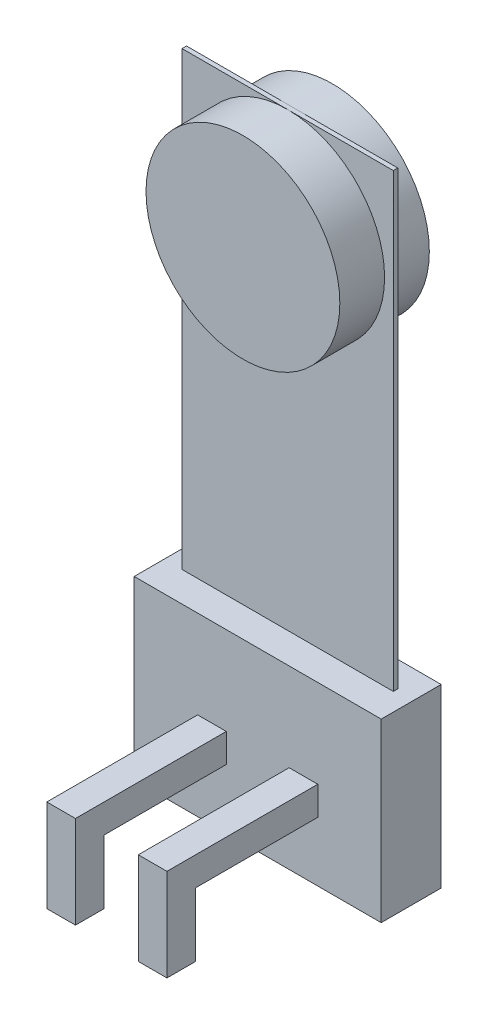
ISO-10303-21;
HEADER;
FILE_DESCRIPTION(('STEP AP214'),'2;1');
FILE_NAME('part.step','',(''),(''),'','','');
FILE_SCHEMA(('AUTOMOTIVE_DESIGN { 1 0 10303 214 1 1 1 1 }'));
ENDSEC;
DATA;
#1=APPLICATION_CONTEXT('core data for automotive mechanical design processes');
#2=APPLICATION_PROTOCOL_DEFINITION('international standard','automotive_design',2000,#1);
#3=PRODUCT_CONTEXT('',#1,'mechanical');
#4=PRODUCT('Part','Part','',(#3));
#5=PRODUCT_RELATED_PRODUCT_CATEGORY('part','',(#4));
#6=PRODUCT_DEFINITION_FORMATION('','',#4);
#7=PRODUCT_DEFINITION_CONTEXT('part definition',#1,'design');
#8=PRODUCT_DEFINITION('design','',#6,#7);
#9=PRODUCT_DEFINITION_SHAPE('','',#8);
#10=(LENGTH_UNIT() NAMED_UNIT(*) SI_UNIT(.MILLI.,.METRE.));
#11=(NAMED_UNIT(*) PLANE_ANGLE_UNIT() SI_UNIT($,.RADIAN.));
#12=(NAMED_UNIT(*) SI_UNIT($,.STERADIAN.) SOLID_ANGLE_UNIT());
#13=UNCERTAINTY_MEASURE_WITH_UNIT(LENGTH_MEASURE(1.E-05),#10,'distance_accuracy_value','');
#14=(GEOMETRIC_REPRESENTATION_CONTEXT(3) GLOBAL_UNCERTAINTY_ASSIGNED_CONTEXT((#13)) GLOBAL_UNIT_ASSIGNED_CONTEXT((#10,
#11,#12)) REPRESENTATION_CONTEXT('',''));
#15=CARTESIAN_POINT('',(0.,0.,0.));
#16=DIRECTION('',(0.,0.,1.));
#17=DIRECTION('',(1.,0.,0.));
#18=AXIS2_PLACEMENT_3D('',#15,#16,#17);
#19=CARTESIAN_POINT('',(6.5024,-5.12381636205132,5.2578));
#20=DIRECTION('',(0.,0.,1.));
#21=DIRECTION('',(1.,0.,0.));
#22=AXIS2_PLACEMENT_3D('',#19,#20,#21);
#23=PLANE('',#22);
#24=DIRECTION('',(0.,1.,0.));
#25=VECTOR('',#24,1.);
#26=CARTESIAN_POINT('',(2.10546162700929,-9.5123,5.2578));
#27=LINE('',#26,#25);
#28=CARTESIAN_POINT('',(2.10546162700929,-5.12381636205132,5.2578));
#29=VERTEX_POINT('',#28);
#30=CARTESIAN_POINT('',(2.10546162700929,-2.5019,5.2578));
#31=VERTEX_POINT('',#30);
#32=EDGE_CURVE('E352',#29,#31,#27,.T.);
#33=ORIENTED_EDGE('',*,*,#32,.T.);
#34=DIRECTION('',(-1.,0.,0.));
#35=VECTOR('',#34,1.);
#36=CARTESIAN_POINT('',(6.5024,-2.5019,5.2578));
#37=LINE('',#36,#35);
#38=CARTESIAN_POINT('',(1.29266162700929,-2.5019,5.2578));
#39=VERTEX_POINT('',#38);
#40=EDGE_CURVE('E58',#31,#39,#37,.T.);
#41=ORIENTED_EDGE('',*,*,#40,.T.);
#42=DIRECTION('',(0.,1.,0.));
#43=VECTOR('',#42,1.);
#44=CARTESIAN_POINT('',(1.29266162700929,-9.5123,5.2578));
#45=LINE('',#44,#43);
#46=CARTESIAN_POINT('',(1.29266162700929,-5.12381636205133,5.2578));
#47=VERTEX_POINT('',#46);
#48=EDGE_CURVE('E377',#47,#39,#45,.T.);
#49=ORIENTED_EDGE('',*,*,#48,.F.);
#50=DIRECTION('',(-1.,0.,0.));
#51=VECTOR('',#50,1.);
#52=CARTESIAN_POINT('',(6.5024,-5.12381636205132,5.2578));
#53=LINE('',#52,#51);
#54=EDGE_CURVE('E393',#29,#47,#53,.T.);
#55=ORIENTED_EDGE('',*,*,#54,.F.);
#56=EDGE_LOOP('',(#33,#41,#49,#55));
#57=FACE_BOUND('',#56,.T.);
#58=ADVANCED_FACE('F32',(#57),#23,.T.);
#59=CARTESIAN_POINT('',(6.5024,-5.12381636205132,4.445));
#60=DIRECTION('',(0.,-1.,0.));
#61=DIRECTION('',(1.,0.,0.));
#62=AXIS2_PLACEMENT_3D('',#59,#60,#61);
#63=PLANE('',#62);
#64=DIRECTION('',(0.,0.,-1.));
#65=VECTOR('',#64,1.);
#66=CARTESIAN_POINT('',(2.10546162700929,-5.12381636205133,4.445));
#67=LINE('',#66,#65);
#68=CARTESIAN_POINT('',(2.10546162700929,-5.12381636205133,4.445));
#69=VERTEX_POINT('',#68);
#70=EDGE_CURVE('E372',#29,#69,#67,.T.);
#71=ORIENTED_EDGE('',*,*,#70,.F.);
#72=ORIENTED_EDGE('',*,*,#54,.T.);
#73=DIRECTION('',(0.,0.,1.));
#74=VECTOR('',#73,1.);
#75=CARTESIAN_POINT('',(1.29266162700929,-5.12381636205133,4.445));
#76=LINE('',#75,#74);
#77=CARTESIAN_POINT('',(1.29266162700929,-5.12381636205133,4.445));
#78=VERTEX_POINT('',#77);
#79=EDGE_CURVE('E388',#78,#47,#76,.T.);
#80=ORIENTED_EDGE('',*,*,#79,.F.);
#81=DIRECTION('',(-1.,0.,0.));
#82=VECTOR('',#81,1.);
#83=CARTESIAN_POINT('',(6.5024,-5.12381636205132,4.445));
#84=LINE('',#83,#82);
#85=EDGE_CURVE('E395',#69,#78,#84,.T.);
#86=ORIENTED_EDGE('',*,*,#85,.F.);
#87=EDGE_LOOP('',(#71,#72,#80,#86));
#88=FACE_BOUND('',#87,.T.);
#89=ADVANCED_FACE('F316',(#88),#63,.T.);
#90=CARTESIAN_POINT('',(6.5024,-3.3147,4.445));
#91=DIRECTION('',(0.,0.,-1.));
#92=DIRECTION('',(-1.,0.,0.));
#93=AXIS2_PLACEMENT_3D('',#90,#91,#92);
#94=PLANE('',#93);
#95=DIRECTION('',(0.,1.,0.));
#96=VECTOR('',#95,1.);
#97=CARTESIAN_POINT('',(2.10546162700929,-3.3147,4.445));
#98=LINE('',#97,#96);
#99=CARTESIAN_POINT('',(2.10546162700929,-3.3147,4.445));
#100=VERTEX_POINT('',#99);
#101=EDGE_CURVE('E370',#69,#100,#98,.T.);
#102=ORIENTED_EDGE('',*,*,#101,.F.);
#103=ORIENTED_EDGE('',*,*,#85,.T.);
#104=DIRECTION('',(0.,-1.,0.));
#105=VECTOR('',#104,1.);
#106=CARTESIAN_POINT('',(1.29266162700929,-3.3147,4.445));
#107=LINE('',#106,#105);
#108=CARTESIAN_POINT('',(1.29266162700929,-3.3147,4.445));
#109=VERTEX_POINT('',#108);
#110=EDGE_CURVE('E385',#109,#78,#107,.T.);
#111=ORIENTED_EDGE('',*,*,#110,.F.);
#112=DIRECTION('',(-1.,0.,0.));
#113=VECTOR('',#112,1.);
#114=CARTESIAN_POINT('',(6.5024,-3.3147,4.445));
#115=LINE('',#114,#113);
#116=EDGE_CURVE('E397',#100,#109,#115,.T.);
#117=ORIENTED_EDGE('',*,*,#116,.F.);
#118=EDGE_LOOP('',(#102,#103,#111,#117));
#119=FACE_BOUND('',#118,.T.);
#120=ADVANCED_FACE('F322',(#119),#94,.T.);
#121=CARTESIAN_POINT('',(6.5024,-3.3147,0.977900000000001));
#122=DIRECTION('',(0.,-1.,0.));
#123=DIRECTION('',(1.,0.,0.));
#124=AXIS2_PLACEMENT_3D('',#121,#122,#123);
#125=PLANE('',#124);
#126=DIRECTION('',(0.,0.,-1.));
#127=VECTOR('',#126,1.);
#128=CARTESIAN_POINT('',(2.10546162700929,-3.3147,0.977900000000001));
#129=LINE('',#128,#127);
#130=CARTESIAN_POINT('',(2.10546162700929,-3.3147,0.9779));
#131=VERTEX_POINT('',#130);
#132=EDGE_CURVE('E368',#100,#131,#129,.T.);
#133=ORIENTED_EDGE('',*,*,#132,.F.);
#134=ORIENTED_EDGE('',*,*,#116,.T.);
#135=DIRECTION('',(0.,0.,1.));
#136=VECTOR('',#135,1.);
#137=CARTESIAN_POINT('',(1.29266162700929,-3.3147,0.977900000000001));
#138=LINE('',#137,#136);
#139=CARTESIAN_POINT('',(1.29266162700929,-3.3147,0.9779));
#140=VERTEX_POINT('',#139);
#141=EDGE_CURVE('E381',#140,#109,#138,.T.);
#142=ORIENTED_EDGE('',*,*,#141,.F.);
#143=DIRECTION('',(-1.,0.,0.));
#144=VECTOR('',#143,1.);
#145=CARTESIAN_POINT('',(6.5024,-3.3147,0.977900000000001));
#146=LINE('',#145,#144);
#147=EDGE_CURVE('E203',#131,#140,#146,.T.);
#148=ORIENTED_EDGE('',*,*,#147,.F.);
#149=EDGE_LOOP('',(#133,#134,#142,#148));
#150=FACE_BOUND('',#149,.T.);
#151=ADVANCED_FACE('F411',(#150),#125,.T.);
#152=CARTESIAN_POINT('',(6.5024,-2.5019,5.2578));
#153=DIRECTION('',(0.,1.,0.));
#154=DIRECTION('',(0.,0.,1.));
#155=AXIS2_PLACEMENT_3D('',#152,#153,#154);
#156=PLANE('',#155);
#157=DIRECTION('',(0.,0.,1.));
#158=VECTOR('',#157,1.);
#159=CARTESIAN_POINT('',(2.10546162700929,-2.5019,5.2578));
#160=LINE('',#159,#158);
#161=CARTESIAN_POINT('',(2.10546162700929,-2.5019,0.9779));
#162=VERTEX_POINT('',#161);
#163=EDGE_CURVE('E348',#162,#31,#160,.T.);
#164=ORIENTED_EDGE('',*,*,#163,.F.);
#165=DIRECTION('',(-1.,0.,0.));
#166=VECTOR('',#165,1.);
#167=CARTESIAN_POINT('',(6.5024,-2.5019,0.9779));
#168=LINE('',#167,#166);
#169=CARTESIAN_POINT('',(1.29266162700929,-2.5019,0.9779));
#170=VERTEX_POINT('',#169);
#171=EDGE_CURVE('E204',#162,#170,#168,.T.);
#172=ORIENTED_EDGE('',*,*,#171,.T.);
#173=DIRECTION('',(0.,0.,-1.));
#174=VECTOR('',#173,1.);
#175=CARTESIAN_POINT('',(1.29266162700929,-2.5019,0.9779));
#176=LINE('',#175,#174);
#177=EDGE_CURVE('E374',#39,#170,#176,.T.);
#178=ORIENTED_EDGE('',*,*,#177,.F.);
#179=ORIENTED_EDGE('',*,*,#40,.F.);
#180=EDGE_LOOP('',(#164,#172,#178,#179));
#181=FACE_BOUND('',#180,.T.);
#182=ADVANCED_FACE('F417',(#181),#156,.T.);
#183=CARTESIAN_POINT('',(0.,0.,0.127));
#184=DIRECTION('',(1.,0.,0.));
#185=DIRECTION('',(0.,0.,-1.));
#186=AXIS2_PLACEMENT_3D('',#183,#184,#185);
#187=PLANE('',#186);
#188=DIRECTION('',(0.,-1.,0.));
#189=VECTOR('',#188,1.);
#190=CARTESIAN_POINT('',(0.,0.,0.));
#191=LINE('',#190,#189);
#192=CARTESIAN_POINT('',(0.,12.8016,0.));
#193=VERTEX_POINT('',#192);
#194=CARTESIAN_POINT('',(0.,0.,0.));
#195=VERTEX_POINT('',#194);
#196=EDGE_CURVE('E242',#193,#195,#191,.T.);
#197=ORIENTED_EDGE('',*,*,#196,.T.);
#198=DIRECTION('',(0.,0.,-1.));
#199=VECTOR('',#198,1.);
#200=CARTESIAN_POINT('',(0.,0.,0.127));
#201=LINE('',#200,#199);
#202=CARTESIAN_POINT('',(0.,0.,0.127));
#203=VERTEX_POINT('',#202);
#204=EDGE_CURVE('E42',#203,#195,#201,.T.);
#205=ORIENTED_EDGE('',*,*,#204,.F.);
#206=DIRECTION('',(0.,-1.,0.));
#207=VECTOR('',#206,1.);
#208=CARTESIAN_POINT('',(0.,0.,0.127));
#209=LINE('',#208,#207);
#210=CARTESIAN_POINT('',(0.,12.8016,0.127));
#211=VERTEX_POINT('',#210);
#212=EDGE_CURVE('E251',#211,#203,#209,.T.);
#213=ORIENTED_EDGE('',*,*,#212,.F.);
#214=DIRECTION('',(0.,0.,-1.));
#215=VECTOR('',#214,1.);
#216=CARTESIAN_POINT('',(0.,12.8016,0.127));
#217=LINE('',#216,#215);
#218=EDGE_CURVE('E262',#211,#193,#217,.T.);
#219=ORIENTED_EDGE('',*,*,#218,.T.);
#220=EDGE_LOOP('',(#197,#205,#213,#219));
#221=FACE_BOUND('',#220,.T.);
#222=ADVANCED_FACE('F34',(#221),#187,.F.);
#223=CARTESIAN_POINT('',(5.9944,0.,0.127));
#224=DIRECTION('',(-1.,0.,0.));
#225=DIRECTION('',(0.,0.,1.));
#226=AXIS2_PLACEMENT_3D('',#223,#224,#225);
#227=PLANE('',#226);
#228=DIRECTION('',(0.,1.,0.));
#229=VECTOR('',#228,1.);
#230=CARTESIAN_POINT('',(5.9944,0.,0.));
#231=LINE('',#230,#229);
#232=CARTESIAN_POINT('',(5.9944,0.,0.));
#233=VERTEX_POINT('',#232);
#234=CARTESIAN_POINT('',(5.9944,12.8016,0.));
#235=VERTEX_POINT('',#234);
#236=EDGE_CURVE('E268',#233,#235,#231,.T.);
#237=ORIENTED_EDGE('',*,*,#236,.T.);
#238=DIRECTION('',(0.,0.,-1.));
#239=VECTOR('',#238,1.);
#240=CARTESIAN_POINT('',(5.9944,12.8016,0.127));
#241=LINE('',#240,#239);
#242=CARTESIAN_POINT('',(5.9944,12.8016,0.127));
#243=VERTEX_POINT('',#242);
#244=EDGE_CURVE('E274',#243,#235,#241,.T.);
#245=ORIENTED_EDGE('',*,*,#244,.F.);
#246=DIRECTION('',(0.,1.,0.));
#247=VECTOR('',#246,1.);
#248=CARTESIAN_POINT('',(5.9944,0.,0.127));
#249=LINE('',#248,#247);
#250=CARTESIAN_POINT('',(5.9944,0.,0.127));
#251=VERTEX_POINT('',#250);
#252=EDGE_CURVE('E256',#251,#243,#249,.T.);
#253=ORIENTED_EDGE('',*,*,#252,.F.);
#254=DIRECTION('',(0.,0.,-1.));
#255=VECTOR('',#254,1.);
#256=CARTESIAN_POINT('',(5.9944,0.,0.127));
#257=LINE('',#256,#255);
#258=EDGE_CURVE('E277',#251,#233,#257,.T.);
#259=ORIENTED_EDGE('',*,*,#258,.T.);
#260=EDGE_LOOP('',(#237,#245,#253,#259));
#261=FACE_BOUND('',#260,.T.);
#262=ADVANCED_FACE('F298',(#261),#227,.F.);
#263=CARTESIAN_POINT('',(0.,12.8016,0.127));
#264=DIRECTION('',(0.,-1.,0.));
#265=DIRECTION('',(1.,0.,0.));
#266=AXIS2_PLACEMENT_3D('',#263,#264,#265);
#267=PLANE('',#266);
#268=DIRECTION('',(-1.,0.,0.));
#269=VECTOR('',#268,1.);
#270=CARTESIAN_POINT('',(0.,12.8016,0.));
#271=LINE('',#270,#269);
#272=CARTESIAN_POINT('',(2.9972,12.8016,0.));
#273=VERTEX_POINT('',#272);
#274=EDGE_CURVE('E254',#235,#273,#271,.T.);
#275=ORIENTED_EDGE('',*,*,#274,.T.);
#276=EDGE_CURVE('E270',#273,#193,#271,.T.);
#277=ORIENTED_EDGE('',*,*,#276,.T.);
#278=ORIENTED_EDGE('',*,*,#218,.F.);
#279=DIRECTION('',(-1.,0.,0.));
#280=VECTOR('',#279,1.);
#281=CARTESIAN_POINT('',(0.,12.8016,0.127));
#282=LINE('',#281,#280);
#283=CARTESIAN_POINT('',(2.9972,12.8016,0.127));
#284=VERTEX_POINT('',#283);
#285=EDGE_CURVE('E258',#284,#211,#282,.T.);
#286=ORIENTED_EDGE('',*,*,#285,.F.);
#287=EDGE_CURVE('E259',#243,#284,#282,.T.);
#288=ORIENTED_EDGE('',*,*,#287,.F.);
#289=ORIENTED_EDGE('',*,*,#244,.T.);
#290=EDGE_LOOP('',(#275,#277,#278,#286,#288,#289));
#291=FACE_BOUND('',#290,.T.);
#292=ADVANCED_FACE('F306',(#291),#267,.F.);
#293=CARTESIAN_POINT('',(0.,0.,0.127));
#294=DIRECTION('',(0.,0.,-1.));
#295=DIRECTION('',(-1.,0.,0.));
#296=AXIS2_PLACEMENT_3D('',#293,#294,#295);
#297=PLANE('',#296);
#298=ORIENTED_EDGE('',*,*,#287,.T.);
#299=CARTESIAN_POINT('',(2.9972,10.0516,0.127));
#300=DIRECTION('',(0.,0.,-1.));
#301=DIRECTION('',(-1.,0.,0.));
#302=AXIS2_PLACEMENT_3D('',#299,#300,#301);
#303=CIRCLE('',#302,2.75);
#304=EDGE_CURVE('E304',#284,#284,#303,.T.);
#305=ORIENTED_EDGE('',*,*,#304,.T.);
#306=ORIENTED_EDGE('',*,*,#285,.T.);
#307=ORIENTED_EDGE('',*,*,#212,.T.);
#308=DIRECTION('',(1.,0.,0.));
#309=VECTOR('',#308,1.);
#310=CARTESIAN_POINT('',(0.,0.,0.127));
#311=LINE('',#310,#309);
#312=EDGE_CURVE('E253',#203,#251,#311,.T.);
#313=ORIENTED_EDGE('',*,*,#312,.T.);
#314=ORIENTED_EDGE('',*,*,#252,.T.);
#315=EDGE_LOOP('',(#298,#305,#306,#307,#313,#314));
#316=FACE_BOUND('',#315,.T.);
#317=ADVANCED_FACE('F301',(#316),#297,.F.);
#318=CARTESIAN_POINT('',(0.,0.,0.));
#319=DIRECTION('',(0.,0.,-1.));
#320=DIRECTION('',(-1.,0.,0.));
#321=AXIS2_PLACEMENT_3D('',#318,#319,#320);
#322=PLANE('',#321);
#323=ORIENTED_EDGE('',*,*,#276,.F.);
#324=CARTESIAN_POINT('',(2.9972,10.0516,0.));
#325=DIRECTION('',(0.,0.,-1.));
#326=DIRECTION('',(-1.,0.,0.));
#327=AXIS2_PLACEMENT_3D('',#324,#325,#326);
#328=CIRCLE('',#327,2.75);
#329=EDGE_CURVE('E11',#273,#273,#328,.T.);
#330=ORIENTED_EDGE('',*,*,#329,.F.);
#331=ORIENTED_EDGE('',*,*,#274,.F.);
#332=ORIENTED_EDGE('',*,*,#236,.F.);
#333=DIRECTION('',(1.,0.,0.));
#334=VECTOR('',#333,1.);
#335=CARTESIAN_POINT('',(0.,0.,0.));
#336=LINE('',#335,#334);
#337=EDGE_CURVE('E265',#195,#233,#336,.T.);
#338=ORIENTED_EDGE('',*,*,#337,.F.);
#339=ORIENTED_EDGE('',*,*,#196,.F.);
#340=EDGE_LOOP('',(#323,#330,#331,#332,#338,#339));
#341=FACE_BOUND('',#340,.T.);
#342=ADVANCED_FACE('F292',(#341),#322,.T.);
#343=CARTESIAN_POINT('',(-0.508,0.,-0.7239));
#344=DIRECTION('',(0.,1.,0.));
#345=DIRECTION('',(0.,0.,1.));
#346=AXIS2_PLACEMENT_3D('',#343,#344,#345);
#347=PLANE('',#346);
#348=DIRECTION('',(0.,0.,1.));
#349=VECTOR('',#348,1.);
#350=CARTESIAN_POINT('',(-0.508,0.,-0.7239));
#351=LINE('',#350,#349);
#352=CARTESIAN_POINT('',(-0.508,0.,-0.7239));
#353=VERTEX_POINT('',#352);
#354=CARTESIAN_POINT('',(-0.508,0.,0.9779));
#355=VERTEX_POINT('',#354);
#356=EDGE_CURVE('E240',#353,#355,#351,.T.);
#357=ORIENTED_EDGE('',*,*,#356,.T.);
#358=DIRECTION('',(-1.,0.,0.));
#359=VECTOR('',#358,1.);
#360=CARTESIAN_POINT('',(-0.508,0.,0.9779));
#361=LINE('',#360,#359);
#362=CARTESIAN_POINT('',(6.5024,0.,0.9779));
#363=VERTEX_POINT('',#362);
#364=EDGE_CURVE('E218',#363,#355,#361,.T.);
#365=ORIENTED_EDGE('',*,*,#364,.F.);
#366=DIRECTION('',(0.,0.,1.));
#367=VECTOR('',#366,1.);
#368=CARTESIAN_POINT('',(6.5024,0.,-0.7239));
#369=LINE('',#368,#367);
#370=CARTESIAN_POINT('',(6.5024,0.,-0.7239));
#371=VERTEX_POINT('',#370);
#372=EDGE_CURVE('E243',#371,#363,#369,.T.);
#373=ORIENTED_EDGE('',*,*,#372,.F.);
#374=DIRECTION('',(-1.,0.,0.));
#375=VECTOR('',#374,1.);
#376=CARTESIAN_POINT('',(-0.508,0.,-0.7239));
#377=LINE('',#376,#375);
#378=EDGE_CURVE('E236',#371,#353,#377,.T.);
#379=ORIENTED_EDGE('',*,*,#378,.T.);
#380=EDGE_LOOP('',(#357,#365,#373,#379));
#381=FACE_BOUND('',#380,.T.);
#382=ORIENTED_EDGE('',*,*,#312,.F.);
#383=ORIENTED_EDGE('',*,*,#204,.T.);
#384=ORIENTED_EDGE('',*,*,#337,.T.);
#385=ORIENTED_EDGE('',*,*,#258,.F.);
#386=EDGE_LOOP('',(#382,#383,#384,#385));
#387=FACE_BOUND('',#386,.T.);
#388=ADVANCED_FACE('F284',(#381,#387),#347,.T.);
#389=CARTESIAN_POINT('',(-0.508,0.,-0.7239));
#390=DIRECTION('',(-1.,0.,0.));
#391=DIRECTION('',(0.,-1.,0.));
#392=AXIS2_PLACEMENT_3D('',#389,#390,#391);
#393=PLANE('',#392);
#394=DIRECTION('',(0.,0.,1.));
#395=VECTOR('',#394,1.);
#396=CARTESIAN_POINT('',(-0.507999999999999,-5.0038,-0.7239));
#397=LINE('',#396,#395);
#398=CARTESIAN_POINT('',(-0.507999999999999,-5.0038,-0.7239));
#399=VERTEX_POINT('',#398);
#400=CARTESIAN_POINT('',(-0.507999999999999,-5.0038,0.9779));
#401=VERTEX_POINT('',#400);
#402=EDGE_CURVE('E239',#399,#401,#397,.T.);
#403=ORIENTED_EDGE('',*,*,#402,.T.);
#404=DIRECTION('',(0.,-1.,0.));
#405=VECTOR('',#404,1.);
#406=CARTESIAN_POINT('',(-0.508,0.,0.9779));
#407=LINE('',#406,#405);
#408=EDGE_CURVE('E220',#355,#401,#407,.T.);
#409=ORIENTED_EDGE('',*,*,#408,.F.);
#410=ORIENTED_EDGE('',*,*,#356,.F.);
#411=DIRECTION('',(0.,-1.,0.));
#412=VECTOR('',#411,1.);
#413=CARTESIAN_POINT('',(-0.508,0.,-0.7239));
#414=LINE('',#413,#412);
#415=EDGE_CURVE('E227',#353,#399,#414,.T.);
#416=ORIENTED_EDGE('',*,*,#415,.T.);
#417=EDGE_LOOP('',(#403,#409,#410,#416));
#418=FACE_BOUND('',#417,.T.);
#419=ADVANCED_FACE('F531',(#418),#393,.T.);
#420=CARTESIAN_POINT('',(6.5024,0.,-0.7239));
#421=DIRECTION('',(1.,0.,0.));
#422=DIRECTION('',(0.,1.,0.));
#423=AXIS2_PLACEMENT_3D('',#420,#421,#422);
#424=PLANE('',#423);
#425=ORIENTED_EDGE('',*,*,#372,.T.);
#426=DIRECTION('',(0.,1.,0.));
#427=VECTOR('',#426,1.);
#428=CARTESIAN_POINT('',(6.5024,0.,0.9779));
#429=LINE('',#428,#427);
#430=CARTESIAN_POINT('',(6.5024,-5.0038,0.9779));
#431=VERTEX_POINT('',#430);
#432=EDGE_CURVE('E215',#431,#363,#429,.T.);
#433=ORIENTED_EDGE('',*,*,#432,.F.);
#434=DIRECTION('',(0.,0.,1.));
#435=VECTOR('',#434,1.);
#436=CARTESIAN_POINT('',(6.5024,-5.0038,-0.7239));
#437=LINE('',#436,#435);
#438=CARTESIAN_POINT('',(6.5024,-5.0038,-0.7239));
#439=VERTEX_POINT('',#438);
#440=EDGE_CURVE('E246',#439,#431,#437,.T.);
#441=ORIENTED_EDGE('',*,*,#440,.F.);
#442=DIRECTION('',(0.,1.,0.));
#443=VECTOR('',#442,1.);
#444=CARTESIAN_POINT('',(6.5024,0.,-0.7239));
#445=LINE('',#444,#443);
#446=EDGE_CURVE('E233',#439,#371,#445,.T.);
#447=ORIENTED_EDGE('',*,*,#446,.T.);
#448=EDGE_LOOP('',(#425,#433,#441,#447));
#449=FACE_BOUND('',#448,.T.);
#450=ADVANCED_FACE('F520',(#449),#424,.T.);
#451=CARTESIAN_POINT('',(-0.507999999999999,-5.0038,-0.7239));
#452=DIRECTION('',(0.,-1.,0.));
#453=DIRECTION('',(0.,0.,-1.));
#454=AXIS2_PLACEMENT_3D('',#451,#452,#453);
#455=PLANE('',#454);
#456=ORIENTED_EDGE('',*,*,#440,.T.);
#457=DIRECTION('',(1.,0.,0.));
#458=VECTOR('',#457,1.);
#459=CARTESIAN_POINT('',(-0.507999999999999,-5.0038,0.9779));
#460=LINE('',#459,#458);
#461=EDGE_CURVE('E219',#401,#431,#460,.T.);
#462=ORIENTED_EDGE('',*,*,#461,.F.);
#463=ORIENTED_EDGE('',*,*,#402,.F.);
#464=DIRECTION('',(1.,0.,0.));
#465=VECTOR('',#464,1.);
#466=CARTESIAN_POINT('',(-0.507999999999999,-5.0038,-0.7239));
#467=LINE('',#466,#465);
#468=EDGE_CURVE('E230',#399,#439,#467,.T.);
#469=ORIENTED_EDGE('',*,*,#468,.T.);
#470=EDGE_LOOP('',(#456,#462,#463,#469));
#471=FACE_BOUND('',#470,.T.);
#472=ADVANCED_FACE('F515',(#471),#455,.T.);
#473=CARTESIAN_POINT('',(0.,0.,-0.7239));
#474=DIRECTION('',(0.,0.,1.));
#475=DIRECTION('',(1.,0.,0.));
#476=AXIS2_PLACEMENT_3D('',#473,#474,#475);
#477=PLANE('',#476);
#478=ORIENTED_EDGE('',*,*,#415,.F.);
#479=ORIENTED_EDGE('',*,*,#378,.F.);
#480=ORIENTED_EDGE('',*,*,#446,.F.);
#481=ORIENTED_EDGE('',*,*,#468,.F.);
#482=EDGE_LOOP('',(#478,#479,#480,#481));
#483=FACE_BOUND('',#482,.T.);
#484=ADVANCED_FACE('F506',(#483),#477,.F.);
#485=CARTESIAN_POINT('',(0.,0.,0.9779));
#486=DIRECTION('',(0.,0.,1.));
#487=DIRECTION('',(1.,0.,0.));
#488=AXIS2_PLACEMENT_3D('',#485,#486,#487);
#489=PLANE('',#488);
#490=ORIENTED_EDGE('',*,*,#461,.T.);
#491=ORIENTED_EDGE('',*,*,#432,.T.);
#492=ORIENTED_EDGE('',*,*,#364,.T.);
#493=ORIENTED_EDGE('',*,*,#408,.T.);
#494=EDGE_LOOP('',(#490,#491,#492,#493));
#495=FACE_BOUND('',#494,.T.);
#496=DIRECTION('',(0.,1.,0.));
#497=VECTOR('',#496,1.);
#498=CARTESIAN_POINT('',(4.70173837299071,-9.5123,0.977900000000002));
#499=LINE('',#498,#497);
#500=CARTESIAN_POINT('',(4.70173837299071,-3.3147,0.977900000000001));
#501=VERTEX_POINT('',#500);
#502=CARTESIAN_POINT('',(4.70173837299071,-2.5019,0.9779));
#503=VERTEX_POINT('',#502);
#504=EDGE_CURVE('E181',#501,#503,#499,.T.);
#505=ORIENTED_EDGE('',*,*,#504,.F.);
#506=CARTESIAN_POINT('',(3.88893837299071,-3.3147,0.9779));
#507=VERTEX_POINT('',#506);
#508=EDGE_CURVE('E36',#501,#507,#146,.T.);
#509=ORIENTED_EDGE('',*,*,#508,.T.);
#510=DIRECTION('',(0.,1.,0.));
#511=VECTOR('',#510,1.);
#512=CARTESIAN_POINT('',(3.88893837299071,-9.5123,0.977900000000002));
#513=LINE('',#512,#511);
#514=CARTESIAN_POINT('',(3.88893837299071,-2.5019,0.9779));
#515=VERTEX_POINT('',#514);
#516=EDGE_CURVE('E201',#507,#515,#513,.T.);
#517=ORIENTED_EDGE('',*,*,#516,.T.);
#518=EDGE_CURVE('E195',#503,#515,#168,.T.);
#519=ORIENTED_EDGE('',*,*,#518,.F.);
#520=EDGE_LOOP('',(#505,#509,#517,#519));
#521=FACE_BOUND('',#520,.T.);
#522=DIRECTION('',(0.,1.,0.));
#523=VECTOR('',#522,1.);
#524=CARTESIAN_POINT('',(2.10546162700929,-9.5123,0.977900000000002));
#525=LINE('',#524,#523);
#526=EDGE_CURVE('E353',#131,#162,#525,.T.);
#527=ORIENTED_EDGE('',*,*,#526,.F.);
#528=ORIENTED_EDGE('',*,*,#147,.T.);
#529=DIRECTION('',(0.,1.,0.));
#530=VECTOR('',#529,1.);
#531=CARTESIAN_POINT('',(1.29266162700929,-9.5123,0.977900000000002));
#532=LINE('',#531,#530);
#533=EDGE_CURVE('E378',#140,#170,#532,.T.);
#534=ORIENTED_EDGE('',*,*,#533,.T.);
#535=ORIENTED_EDGE('',*,*,#171,.F.);
#536=EDGE_LOOP('',(#527,#528,#534,#535));
#537=FACE_BOUND('',#536,.T.);
#538=ADVANCED_FACE('F198',(#495,#521,#537),#489,.T.);
#539=CARTESIAN_POINT('',(2.9972,10.0516,-1.143));
#540=DIRECTION('',(0.,0.,1.));
#541=DIRECTION('',(1.,0.,0.));
#542=AXIS2_PLACEMENT_3D('',#539,#540,#541);
#543=PLANE('',#542);
#544=CARTESIAN_POINT('',(2.9972,10.0516,-1.143));
#545=DIRECTION('',(0.,0.,1.));
#546=DIRECTION('',(1.,0.,0.));
#547=AXIS2_PLACEMENT_3D('',#544,#545,#546);
#548=CIRCLE('',#547,2.75);
#549=CARTESIAN_POINT('',(5.7472,10.0516,-1.143));
#550=VERTEX_POINT('',#549);
#551=EDGE_CURVE('E661',#550,#550,#548,.T.);
#552=ORIENTED_EDGE('',*,*,#551,.F.);
#553=EDGE_LOOP('',(#552));
#554=FACE_BOUND('',#553,.T.);
#555=ADVANCED_FACE('F505',(#554),#543,.F.);
#556=CARTESIAN_POINT('',(2.9972,10.0516,-1.143));
#557=DIRECTION('',(0.,0.,1.));
#558=DIRECTION('',(1.,0.,0.));
#559=AXIS2_PLACEMENT_3D('',#556,#557,#558);
#560=CYLINDRICAL_SURFACE('',#559,2.75);
#561=ORIENTED_EDGE('',*,*,#329,.T.);
#562=EDGE_LOOP('',(#561));
#563=FACE_BOUND('',#562,.T.);
#564=ORIENTED_EDGE('',*,*,#551,.T.);
#565=EDGE_LOOP('',(#564));
#566=FACE_BOUND('',#565,.T.);
#567=ADVANCED_FACE('F585',(#563,#566),#560,.T.);
#568=CARTESIAN_POINT('',(2.9972,10.0516,1.397));
#569=DIRECTION('',(0.,0.,1.));
#570=DIRECTION('',(1.,0.,0.));
#571=AXIS2_PLACEMENT_3D('',#568,#569,#570);
#572=CIRCLE('',#571,2.75);
#573=CARTESIAN_POINT('',(5.7472,10.0516,1.397));
#574=VERTEX_POINT('',#573);
#575=EDGE_CURVE('E392',#574,#574,#572,.T.);
#576=ORIENTED_EDGE('',*,*,#575,.F.);
#577=EDGE_LOOP('',(#576));
#578=FACE_BOUND('',#577,.T.);
#579=ORIENTED_EDGE('',*,*,#304,.F.);
#580=EDGE_LOOP('',(#579));
#581=FACE_BOUND('',#580,.T.);
#582=ADVANCED_FACE('F336',(#578,#581),#560,.T.);
#583=CARTESIAN_POINT('',(2.9972,10.0516,1.397));
#584=DIRECTION('',(0.,0.,1.));
#585=DIRECTION('',(1.,0.,0.));
#586=AXIS2_PLACEMENT_3D('',#583,#584,#585);
#587=PLANE('',#586);
#588=ORIENTED_EDGE('',*,*,#575,.T.);
#589=EDGE_LOOP('',(#588));
#590=FACE_BOUND('',#589,.T.);
#591=ADVANCED_FACE('F329',(#590),#587,.T.);
#592=DIRECTION('',(0.,1.,0.));
#593=VECTOR('',#592,1.);
#594=CARTESIAN_POINT('',(4.70173837299071,-9.5123,5.2578));
#595=LINE('',#594,#593);
#596=CARTESIAN_POINT('',(4.70173837299071,-5.12381636205132,5.2578));
#597=VERTEX_POINT('',#596);
#598=CARTESIAN_POINT('',(4.70173837299071,-2.5019,5.2578));
#599=VERTEX_POINT('',#598);
#600=EDGE_CURVE('E190',#597,#599,#595,.T.);
#601=ORIENTED_EDGE('',*,*,#600,.T.);
#602=CARTESIAN_POINT('',(3.88893837299071,-2.5019,5.2578));
#603=VERTEX_POINT('',#602);
#604=EDGE_CURVE('E50',#599,#603,#37,.T.);
#605=ORIENTED_EDGE('',*,*,#604,.T.);
#606=DIRECTION('',(0.,1.,0.));
#607=VECTOR('',#606,1.);
#608=CARTESIAN_POINT('',(3.88893837299071,-9.5123,5.2578));
#609=LINE('',#608,#607);
#610=CARTESIAN_POINT('',(3.88893837299071,-5.12381636205132,5.2578));
#611=VERTEX_POINT('',#610);
#612=EDGE_CURVE('E357',#611,#603,#609,.T.);
#613=ORIENTED_EDGE('',*,*,#612,.F.);
#614=EDGE_CURVE('E339',#597,#611,#53,.T.);
#615=ORIENTED_EDGE('',*,*,#614,.F.);
#616=EDGE_LOOP('',(#601,#605,#613,#615));
#617=FACE_BOUND('',#616,.T.);
#618=ADVANCED_FACE('F318',(#617),#23,.T.);
#619=DIRECTION('',(0.,0.,-1.));
#620=VECTOR('',#619,1.);
#621=CARTESIAN_POINT('',(4.70173837299071,-5.12381636205132,4.445));
#622=LINE('',#621,#620);
#623=CARTESIAN_POINT('',(4.70173837299071,-5.12381636205132,4.445));
#624=VERTEX_POINT('',#623);
#625=EDGE_CURVE('E346',#597,#624,#622,.T.);
#626=ORIENTED_EDGE('',*,*,#625,.F.);
#627=ORIENTED_EDGE('',*,*,#614,.T.);
#628=DIRECTION('',(0.,0.,1.));
#629=VECTOR('',#628,1.);
#630=CARTESIAN_POINT('',(3.88893837299071,-5.12381636205132,4.445));
#631=LINE('',#630,#629);
#632=CARTESIAN_POINT('',(3.88893837299071,-5.12381636205133,4.445));
#633=VERTEX_POINT('',#632);
#634=EDGE_CURVE('E365',#633,#611,#631,.T.);
#635=ORIENTED_EDGE('',*,*,#634,.F.);
#636=EDGE_CURVE('E394',#624,#633,#84,.T.);
#637=ORIENTED_EDGE('',*,*,#636,.F.);
#638=EDGE_LOOP('',(#626,#627,#635,#637));
#639=FACE_BOUND('',#638,.T.);
#640=ADVANCED_FACE('F325',(#639),#63,.T.);
#641=DIRECTION('',(0.,1.,0.));
#642=VECTOR('',#641,1.);
#643=CARTESIAN_POINT('',(4.70173837299071,-3.3147,4.445));
#644=LINE('',#643,#642);
#645=CARTESIAN_POINT('',(4.70173837299071,-3.3147,4.445));
#646=VERTEX_POINT('',#645);
#647=EDGE_CURVE('E342',#624,#646,#644,.T.);
#648=ORIENTED_EDGE('',*,*,#647,.F.);
#649=ORIENTED_EDGE('',*,*,#636,.T.);
#650=DIRECTION('',(0.,-1.,0.));
#651=VECTOR('',#650,1.);
#652=CARTESIAN_POINT('',(3.88893837299071,-3.3147,4.445));
#653=LINE('',#652,#651);
#654=CARTESIAN_POINT('',(3.88893837299071,-3.3147,4.445));
#655=VERTEX_POINT('',#654);
#656=EDGE_CURVE('E362',#655,#633,#653,.T.);
#657=ORIENTED_EDGE('',*,*,#656,.F.);
#658=EDGE_CURVE('E396',#646,#655,#115,.T.);
#659=ORIENTED_EDGE('',*,*,#658,.F.);
#660=EDGE_LOOP('',(#648,#649,#657,#659));
#661=FACE_BOUND('',#660,.T.);
#662=ADVANCED_FACE('F334',(#661),#94,.T.);
#663=DIRECTION('',(0.,0.,-1.));
#664=VECTOR('',#663,1.);
#665=CARTESIAN_POINT('',(4.70173837299071,-3.3147,0.977900000000001));
#666=LINE('',#665,#664);
#667=EDGE_CURVE('E186',#646,#501,#666,.T.);
#668=ORIENTED_EDGE('',*,*,#667,.F.);
#669=ORIENTED_EDGE('',*,*,#658,.T.);
#670=DIRECTION('',(0.,0.,1.));
#671=VECTOR('',#670,1.);
#672=CARTESIAN_POINT('',(3.88893837299071,-3.3147,0.977900000000001));
#673=LINE('',#672,#671);
#674=EDGE_CURVE('E355',#507,#655,#673,.T.);
#675=ORIENTED_EDGE('',*,*,#674,.F.);
#676=ORIENTED_EDGE('',*,*,#508,.F.);
#677=EDGE_LOOP('',(#668,#669,#675,#676));
#678=FACE_BOUND('',#677,.T.);
#679=ADVANCED_FACE('F408',(#678),#125,.T.);
#680=DIRECTION('',(0.,0.,1.));
#681=VECTOR('',#680,1.);
#682=CARTESIAN_POINT('',(4.70173837299071,-2.5019,5.2578));
#683=LINE('',#682,#681);
#684=EDGE_CURVE('E184',#503,#599,#683,.T.);
#685=ORIENTED_EDGE('',*,*,#684,.F.);
#686=ORIENTED_EDGE('',*,*,#518,.T.);
#687=DIRECTION('',(0.,0.,-1.));
#688=VECTOR('',#687,1.);
#689=CARTESIAN_POINT('',(3.88893837299071,-2.5019,5.2578));
#690=LINE('',#689,#688);
#691=EDGE_CURVE('E350',#603,#515,#690,.T.);
#692=ORIENTED_EDGE('',*,*,#691,.F.);
#693=ORIENTED_EDGE('',*,*,#604,.F.);
#694=EDGE_LOOP('',(#685,#686,#692,#693));
#695=FACE_BOUND('',#694,.T.);
#696=ADVANCED_FACE('F193',(#695),#156,.T.);
#697=CARTESIAN_POINT('',(1.29266162700929,-9.5123,0.977900000000002));
#698=DIRECTION('',(1.,0.,0.));
#699=DIRECTION('',(0.,1.,0.));
#700=AXIS2_PLACEMENT_3D('',#697,#698,#699);
#701=PLANE('',#700);
#702=ORIENTED_EDGE('',*,*,#79,.T.);
#703=ORIENTED_EDGE('',*,*,#48,.T.);
#704=ORIENTED_EDGE('',*,*,#177,.T.);
#705=ORIENTED_EDGE('',*,*,#533,.F.);
#706=ORIENTED_EDGE('',*,*,#141,.T.);
#707=ORIENTED_EDGE('',*,*,#110,.T.);
#708=EDGE_LOOP('',(#702,#703,#704,#705,#706,#707));
#709=FACE_BOUND('',#708,.T.);
#710=ADVANCED_FACE('F416',(#709),#701,.F.);
#711=CARTESIAN_POINT('',(2.10546162700929,-9.5123,5.2578));
#712=DIRECTION('',(-1.,0.,0.));
#713=DIRECTION('',(0.,-1.,0.));
#714=AXIS2_PLACEMENT_3D('',#711,#712,#713);
#715=PLANE('',#714);
#716=ORIENTED_EDGE('',*,*,#70,.T.);
#717=ORIENTED_EDGE('',*,*,#101,.T.);
#718=ORIENTED_EDGE('',*,*,#132,.T.);
#719=ORIENTED_EDGE('',*,*,#526,.T.);
#720=ORIENTED_EDGE('',*,*,#163,.T.);
#721=ORIENTED_EDGE('',*,*,#32,.F.);
#722=EDGE_LOOP('',(#716,#717,#718,#719,#720,#721));
#723=FACE_BOUND('',#722,.T.);
#724=ADVANCED_FACE('F441',(#723),#715,.F.);
#725=CARTESIAN_POINT('',(3.88893837299071,-9.5123,5.2578));
#726=DIRECTION('',(1.,0.,0.));
#727=DIRECTION('',(0.,1.,0.));
#728=AXIS2_PLACEMENT_3D('',#725,#726,#727);
#729=PLANE('',#728);
#730=ORIENTED_EDGE('',*,*,#634,.T.);
#731=ORIENTED_EDGE('',*,*,#612,.T.);
#732=ORIENTED_EDGE('',*,*,#691,.T.);
#733=ORIENTED_EDGE('',*,*,#516,.F.);
#734=ORIENTED_EDGE('',*,*,#674,.T.);
#735=ORIENTED_EDGE('',*,*,#656,.T.);
#736=EDGE_LOOP('',(#730,#731,#732,#733,#734,#735));
#737=FACE_BOUND('',#736,.T.);
#738=ADVANCED_FACE('F406',(#737),#729,.F.);
#739=CARTESIAN_POINT('',(4.70173837299071,-9.5123,5.2578));
#740=DIRECTION('',(-1.,0.,0.));
#741=DIRECTION('',(0.,-1.,0.));
#742=AXIS2_PLACEMENT_3D('',#739,#740,#741);
#743=PLANE('',#742);
#744=ORIENTED_EDGE('',*,*,#625,.T.);
#745=ORIENTED_EDGE('',*,*,#647,.T.);
#746=ORIENTED_EDGE('',*,*,#667,.T.);
#747=ORIENTED_EDGE('',*,*,#504,.T.);
#748=ORIENTED_EDGE('',*,*,#684,.T.);
#749=ORIENTED_EDGE('',*,*,#600,.F.);
#750=EDGE_LOOP('',(#744,#745,#746,#747,#748,#749));
#751=FACE_BOUND('',#750,.T.);
#752=ADVANCED_FACE('F183',(#751),#743,.F.);
#753=CLOSED_SHELL('',(#58,#89,#120,#151,#182,#222,#262,#292,#317,#342,#388,#419,#450,#472,#484,
#538,#555,#567,#582,#591,#618,#640,#662,#679,#696,#710,#724,#738,#752));
#754=MANIFOLD_SOLID_BREP('B2',#753);
#755=ADVANCED_BREP_SHAPE_REPRESENTATION('',(#18,#754),#14);
#756=SHAPE_DEFINITION_REPRESENTATION(#9,#755);
ENDSEC;
END-ISO-10303-21;
